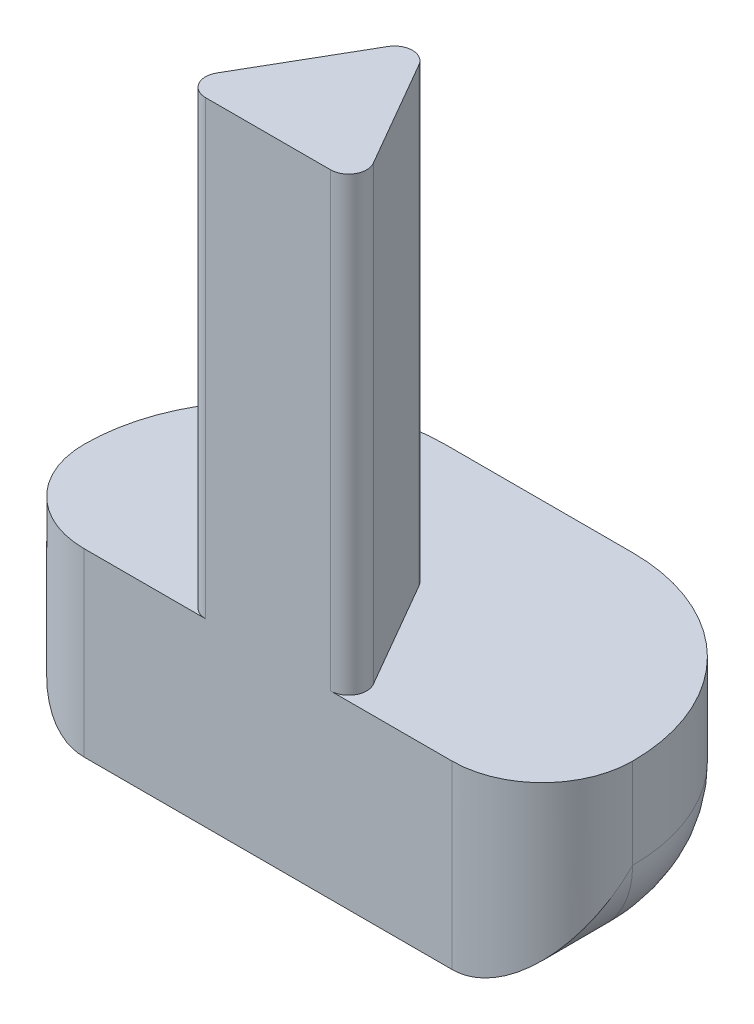
ISO-10303-21;
HEADER;
FILE_DESCRIPTION(('STEP AP214'),'2;1');
FILE_NAME('part.step','',(''),(''),'','','');
FILE_SCHEMA(('AUTOMOTIVE_DESIGN { 1 0 10303 214 1 1 1 1 }'));
ENDSEC;
DATA;
#1=APPLICATION_CONTEXT('core data for automotive mechanical design processes');
#2=APPLICATION_PROTOCOL_DEFINITION('international standard','automotive_design',2000,#1);
#3=PRODUCT_CONTEXT('',#1,'mechanical');
#4=PRODUCT('Part','Part','',(#3));
#5=PRODUCT_RELATED_PRODUCT_CATEGORY('part','',(#4));
#6=PRODUCT_DEFINITION_FORMATION('','',#4);
#7=PRODUCT_DEFINITION_CONTEXT('part definition',#1,'design');
#8=PRODUCT_DEFINITION('design','',#6,#7);
#9=PRODUCT_DEFINITION_SHAPE('','',#8);
#10=(LENGTH_UNIT() NAMED_UNIT(*) SI_UNIT(.MILLI.,.METRE.));
#11=(NAMED_UNIT(*) PLANE_ANGLE_UNIT() SI_UNIT($,.RADIAN.));
#12=(NAMED_UNIT(*) SI_UNIT($,.STERADIAN.) SOLID_ANGLE_UNIT());
#13=UNCERTAINTY_MEASURE_WITH_UNIT(LENGTH_MEASURE(1.E-05),#10,'distance_accuracy_value','');
#14=(GEOMETRIC_REPRESENTATION_CONTEXT(3) GLOBAL_UNCERTAINTY_ASSIGNED_CONTEXT((#13)) GLOBAL_UNIT_ASSIGNED_CONTEXT((#10,
#11,#12)) REPRESENTATION_CONTEXT('',''));
#15=CARTESIAN_POINT('',(0.,0.,0.));
#16=DIRECTION('',(0.,0.,1.));
#17=DIRECTION('',(1.,0.,0.));
#18=AXIS2_PLACEMENT_3D('',#15,#16,#17);
#19=CARTESIAN_POINT('',(-1.03923048454133,5.,-1.8));
#20=DIRECTION('',(-0.866025403784439,0.,0.5));
#21=DIRECTION('',(0.5,0.,0.866025403784439));
#22=AXIS2_PLACEMENT_3D('',#19,#20,#21);
#23=PLANE('',#22);
#24=DIRECTION('',(-0.5,0.,-0.866025403784438));
#25=VECTOR('',#24,1.);
#26=CARTESIAN_POINT('',(-1.03923048454133,5.,-1.8));
#27=LINE('',#26,#25);
#28=CARTESIAN_POINT('',(-0.173205080756888,5.,-0.300000000000001));
#29=VERTEX_POINT('',#28);
#30=CARTESIAN_POINT('',(-0.866025403784439,5.,-1.5));
#31=VERTEX_POINT('',#30);
#32=EDGE_CURVE('E177',#29,#31,#27,.T.);
#33=ORIENTED_EDGE('',*,*,#32,.F.);
#34=DIRECTION('',(0.,-1.,0.));
#35=VECTOR('',#34,1.);
#36=CARTESIAN_POINT('',(-0.173205080756888,5.,-0.3));
#37=LINE('',#36,#35);
#38=CARTESIAN_POINT('',(-0.173205080756888,0.,-0.300000000000001));
#39=VERTEX_POINT('',#38);
#40=EDGE_CURVE('E228',#29,#39,#37,.T.);
#41=ORIENTED_EDGE('',*,*,#40,.T.);
#42=DIRECTION('',(-0.5,0.,-0.866025403784438));
#43=VECTOR('',#42,1.);
#44=CARTESIAN_POINT('',(-1.03923048454133,0.,-1.8));
#45=LINE('',#44,#43);
#46=CARTESIAN_POINT('',(-0.866025403784439,0.,-1.5));
#47=VERTEX_POINT('',#46);
#48=EDGE_CURVE('E145',#39,#47,#45,.T.);
#49=ORIENTED_EDGE('',*,*,#48,.T.);
#50=DIRECTION('',(0.,-1.,0.));
#51=VECTOR('',#50,1.);
#52=CARTESIAN_POINT('',(-0.866025403784439,5.,-1.5));
#53=LINE('',#52,#51);
#54=EDGE_CURVE('E213',#47,#31,#53,.F.);
#55=ORIENTED_EDGE('',*,*,#54,.T.);
#56=EDGE_LOOP('',(#33,#41,#49,#55));
#57=FACE_BOUND('',#56,.T.);
#58=ADVANCED_FACE('F35',(#57),#23,.F.);
#59=CARTESIAN_POINT('',(-2.07846096908265,5.,0.));
#60=DIRECTION('',(0.866025403784439,0.,0.5));
#61=DIRECTION('',(0.5,0.,-0.866025403784439));
#62=AXIS2_PLACEMENT_3D('',#59,#60,#61);
#63=PLANE('',#62);
#64=DIRECTION('',(-0.5,0.,0.866025403784439));
#65=VECTOR('',#64,1.);
#66=CARTESIAN_POINT('',(-2.07846096908265,0.,0.));
#67=LINE('',#66,#65);
#68=CARTESIAN_POINT('',(-1.21243556529821,0.,-1.5));
#69=VERTEX_POINT('',#68);
#70=CARTESIAN_POINT('',(-1.90525588832576,0.,-0.3));
#71=VERTEX_POINT('',#70);
#72=EDGE_CURVE('E181',#69,#71,#67,.T.);
#73=ORIENTED_EDGE('',*,*,#72,.T.);
#74=DIRECTION('',(0.,-1.,0.));
#75=VECTOR('',#74,1.);
#76=CARTESIAN_POINT('',(-1.90525588832576,5.,-0.3));
#77=LINE('',#76,#75);
#78=CARTESIAN_POINT('',(-1.90525588832576,5.,-0.3));
#79=VERTEX_POINT('',#78);
#80=EDGE_CURVE('E244',#71,#79,#77,.F.);
#81=ORIENTED_EDGE('',*,*,#80,.T.);
#82=DIRECTION('',(-0.5,0.,0.866025403784439));
#83=VECTOR('',#82,1.);
#84=CARTESIAN_POINT('',(-2.07846096908265,5.,0.));
#85=LINE('',#84,#83);
#86=CARTESIAN_POINT('',(-1.21243556529821,5.,-1.5));
#87=VERTEX_POINT('',#86);
#88=EDGE_CURVE('E180',#87,#79,#85,.T.);
#89=ORIENTED_EDGE('',*,*,#88,.F.);
#90=DIRECTION('',(0.,-1.,0.));
#91=VECTOR('',#90,1.);
#92=CARTESIAN_POINT('',(-1.21243556529821,5.,-1.5));
#93=LINE('',#92,#91);
#94=EDGE_CURVE('E242',#87,#69,#93,.T.);
#95=ORIENTED_EDGE('',*,*,#94,.T.);
#96=EDGE_LOOP('',(#73,#81,#89,#95));
#97=FACE_BOUND('',#96,.T.);
#98=ADVANCED_FACE('F312',(#97),#63,.F.);
#99=CARTESIAN_POINT('',(0.,5.,0.));
#100=DIRECTION('',(0.,0.,-1.));
#101=DIRECTION('',(-1.,0.,0.));
#102=AXIS2_PLACEMENT_3D('',#99,#100,#101);
#103=PLANE('',#102);
#104=DIRECTION('',(1.,0.,0.));
#105=VECTOR('',#104,1.);
#106=CARTESIAN_POINT('',(-4.07846096908265,0.,0.));
#107=LINE('',#106,#105);
#108=CARTESIAN_POINT('',(-0.346410161513775,0.,0.));
#109=VERTEX_POINT('',#108);
#110=CARTESIAN_POINT('',(0.999999999999998,0.,0.));
#111=VERTEX_POINT('',#110);
#112=EDGE_CURVE('E156',#109,#111,#107,.T.);
#113=ORIENTED_EDGE('',*,*,#112,.F.);
#114=DIRECTION('',(0.,-1.,0.));
#115=VECTOR('',#114,1.);
#116=CARTESIAN_POINT('',(-0.346410161513775,5.,0.));
#117=LINE('',#116,#115);
#118=CARTESIAN_POINT('',(-0.346410161513775,5.,0.));
#119=VERTEX_POINT('',#118);
#120=EDGE_CURVE('E234',#109,#119,#117,.F.);
#121=ORIENTED_EDGE('',*,*,#120,.T.);
#122=DIRECTION('',(1.,0.,0.));
#123=VECTOR('',#122,1.);
#124=CARTESIAN_POINT('',(0.,5.,0.));
#125=LINE('',#124,#123);
#126=CARTESIAN_POINT('',(-1.73205080756888,5.,0.));
#127=VERTEX_POINT('',#126);
#128=EDGE_CURVE('E184',#127,#119,#125,.T.);
#129=ORIENTED_EDGE('',*,*,#128,.F.);
#130=DIRECTION('',(0.,-1.,0.));
#131=VECTOR('',#130,1.);
#132=CARTESIAN_POINT('',(-1.73205080756888,5.,0.));
#133=LINE('',#132,#131);
#134=CARTESIAN_POINT('',(-1.73205080756888,0.,0.));
#135=VERTEX_POINT('',#134);
#136=EDGE_CURVE('E231',#127,#135,#133,.T.);
#137=ORIENTED_EDGE('',*,*,#136,.T.);
#138=CARTESIAN_POINT('',(-3.07846096908265,0.,0.));
#139=VERTEX_POINT('',#138);
#140=EDGE_CURVE('E169',#139,#135,#107,.T.);
#141=ORIENTED_EDGE('',*,*,#140,.F.);
#142=DIRECTION('',(0.,1.,0.));
#143=VECTOR('',#142,1.);
#144=CARTESIAN_POINT('',(-3.07846096908265,5.,0.));
#145=LINE('',#144,#143);
#146=CARTESIAN_POINT('',(-3.07846096908265,-2.,0.));
#147=VERTEX_POINT('',#146);
#148=EDGE_CURVE('E211',#139,#147,#145,.F.);
#149=ORIENTED_EDGE('',*,*,#148,.T.);
#150=DIRECTION('',(1.,0.,0.));
#151=VECTOR('',#150,1.);
#152=CARTESIAN_POINT('',(-4.07846096908265,-2.,0.));
#153=LINE('',#152,#151);
#154=CARTESIAN_POINT('',(0.999999999999998,-2.,0.));
#155=VERTEX_POINT('',#154);
#156=EDGE_CURVE('E167',#147,#155,#153,.T.);
#157=ORIENTED_EDGE('',*,*,#156,.T.);
#158=DIRECTION('',(0.,1.,0.));
#159=VECTOR('',#158,1.);
#160=CARTESIAN_POINT('',(1.,0.,0.));
#161=LINE('',#160,#159);
#162=EDGE_CURVE('E209',#155,#111,#161,.T.);
#163=ORIENTED_EDGE('',*,*,#162,.T.);
#164=EDGE_LOOP('',(#113,#121,#129,#137,#141,#149,#157,#163));
#165=FACE_BOUND('',#164,.T.);
#166=ADVANCED_FACE('F256',(#165),#103,.F.);
#167=CARTESIAN_POINT('',(0.,5.,0.));
#168=DIRECTION('',(0.,-1.,0.));
#169=DIRECTION('',(0.,0.,-1.));
#170=AXIS2_PLACEMENT_3D('',#167,#168,#169);
#171=PLANE('',#170);
#172=ORIENTED_EDGE('',*,*,#128,.T.);
#173=CARTESIAN_POINT('',(-0.346410161513775,5.,-0.2));
#174=DIRECTION('',(0.,-1.,0.));
#175=DIRECTION('',(0.,0.,-1.));
#176=AXIS2_PLACEMENT_3D('',#173,#174,#175);
#177=CIRCLE('',#176,0.2);
#178=EDGE_CURVE('E240',#119,#29,#177,.F.);
#179=ORIENTED_EDGE('',*,*,#178,.T.);
#180=ORIENTED_EDGE('',*,*,#32,.T.);
#181=CARTESIAN_POINT('',(-1.03923048454133,5.,-1.4));
#182=DIRECTION('',(0.,-1.,0.));
#183=DIRECTION('',(0.,0.,-1.));
#184=AXIS2_PLACEMENT_3D('',#181,#182,#183);
#185=CIRCLE('',#184,0.2);
#186=EDGE_CURVE('E236',#31,#87,#185,.F.);
#187=ORIENTED_EDGE('',*,*,#186,.T.);
#188=ORIENTED_EDGE('',*,*,#88,.T.);
#189=CARTESIAN_POINT('',(-1.73205080756888,5.,-0.2));
#190=DIRECTION('',(0.,-1.,0.));
#191=DIRECTION('',(0.,0.,-1.));
#192=AXIS2_PLACEMENT_3D('',#189,#190,#191);
#193=CIRCLE('',#192,0.2);
#194=EDGE_CURVE('E238',#79,#127,#193,.F.);
#195=ORIENTED_EDGE('',*,*,#194,.T.);
#196=EDGE_LOOP('',(#172,#179,#180,#187,#188,#195));
#197=FACE_BOUND('',#196,.T.);
#198=ADVANCED_FACE('F259',(#197),#171,.F.);
#199=CARTESIAN_POINT('',(-2.07846096908264,-2.,-3.));
#200=DIRECTION('',(0.,0.,1.));
#201=DIRECTION('',(1.,0.,0.));
#202=AXIS2_PLACEMENT_3D('',#199,#200,#201);
#203=PLANE('',#202);
#204=DIRECTION('',(0.,1.,0.));
#205=VECTOR('',#204,1.);
#206=CARTESIAN_POINT('',(0.,-2.,-3.));
#207=LINE('',#206,#205);
#208=CARTESIAN_POINT('',(0.,-1.,-3.));
#209=VERTEX_POINT('',#208);
#210=CARTESIAN_POINT('',(0.,0.,-3.));
#211=VERTEX_POINT('',#210);
#212=EDGE_CURVE('E135',#209,#211,#207,.T.);
#213=ORIENTED_EDGE('',*,*,#212,.F.);
#214=DIRECTION('',(1.,0.,0.));
#215=VECTOR('',#214,1.);
#216=CARTESIAN_POINT('',(-2.07846096908264,-1.,-3.));
#217=LINE('',#216,#215);
#218=CARTESIAN_POINT('',(-2.07846096908264,-1.,-3.));
#219=VERTEX_POINT('',#218);
#220=EDGE_CURVE('E203',#209,#219,#217,.F.);
#221=ORIENTED_EDGE('',*,*,#220,.T.);
#222=DIRECTION('',(0.,1.,0.));
#223=VECTOR('',#222,1.);
#224=CARTESIAN_POINT('',(-2.07846096908264,-2.,-3.));
#225=LINE('',#224,#223);
#226=CARTESIAN_POINT('',(-2.07846096908264,0.,-3.));
#227=VERTEX_POINT('',#226);
#228=EDGE_CURVE('E160',#219,#227,#225,.T.);
#229=ORIENTED_EDGE('',*,*,#228,.T.);
#230=DIRECTION('',(1.,0.,0.));
#231=VECTOR('',#230,1.);
#232=CARTESIAN_POINT('',(-2.07846096908264,0.,-3.));
#233=LINE('',#232,#231);
#234=EDGE_CURVE('E151',#227,#211,#233,.T.);
#235=ORIENTED_EDGE('',*,*,#234,.T.);
#236=EDGE_LOOP('',(#213,#221,#229,#235));
#237=FACE_BOUND('',#236,.T.);
#238=ADVANCED_FACE('F158',(#237),#203,.F.);
#239=CARTESIAN_POINT('',(0.,-2.,-1.));
#240=DIRECTION('',(0.,1.,0.));
#241=DIRECTION('',(0.,0.,1.));
#242=AXIS2_PLACEMENT_3D('',#239,#240,#241);
#243=CYLINDRICAL_SURFACE('',#242,2.);
#244=DIRECTION('',(0.,1.,0.));
#245=VECTOR('',#244,1.);
#246=CARTESIAN_POINT('',(2.,-2.,-0.999999999999986));
#247=LINE('',#246,#245);
#248=CARTESIAN_POINT('',(2.,-1.,-0.999999999999986));
#249=VERTEX_POINT('',#248);
#250=CARTESIAN_POINT('',(2.,0.,-0.999999999999986));
#251=VERTEX_POINT('',#250);
#252=EDGE_CURVE('E146',#249,#251,#247,.T.);
#253=ORIENTED_EDGE('',*,*,#252,.F.);
#254=CARTESIAN_POINT('',(0.,-1.,-1.));
#255=DIRECTION('',(0.,-1.,0.));
#256=DIRECTION('',(0.,0.,-1.));
#257=AXIS2_PLACEMENT_3D('',#254,#255,#256);
#258=CIRCLE('',#257,2.);
#259=EDGE_CURVE('E141',#249,#209,#258,.F.);
#260=ORIENTED_EDGE('',*,*,#259,.T.);
#261=ORIENTED_EDGE('',*,*,#212,.T.);
#262=CARTESIAN_POINT('',(0.,0.,-1.));
#263=DIRECTION('',(0.,-1.,0.));
#264=DIRECTION('',(0.,0.,-1.));
#265=AXIS2_PLACEMENT_3D('',#262,#263,#264);
#266=CIRCLE('',#265,2.);
#267=EDGE_CURVE('E138',#211,#251,#266,.T.);
#268=ORIENTED_EDGE('',*,*,#267,.T.);
#269=EDGE_LOOP('',(#253,#260,#261,#268));
#270=FACE_BOUND('',#269,.T.);
#271=ADVANCED_FACE('F137',(#270),#243,.T.);
#272=CARTESIAN_POINT('',(-2.07846096908265,-2.,-1.));
#273=DIRECTION('',(0.,1.,0.));
#274=DIRECTION('',(0.,0.,1.));
#275=AXIS2_PLACEMENT_3D('',#272,#273,#274);
#276=CYLINDRICAL_SURFACE('',#275,2.);
#277=ORIENTED_EDGE('',*,*,#228,.F.);
#278=CARTESIAN_POINT('',(-2.07846096908265,-1.,-1.));
#279=DIRECTION('',(0.,-1.,0.));
#280=DIRECTION('',(0.,0.,-1.));
#281=AXIS2_PLACEMENT_3D('',#278,#279,#280);
#282=CIRCLE('',#281,2.);
#283=CARTESIAN_POINT('',(-4.07846096908265,-1.,-0.999999999999986));
#284=VERTEX_POINT('',#283);
#285=EDGE_CURVE('E201',#219,#284,#282,.F.);
#286=ORIENTED_EDGE('',*,*,#285,.T.);
#287=DIRECTION('',(0.,1.,0.));
#288=VECTOR('',#287,1.);
#289=CARTESIAN_POINT('',(-4.07846096908265,-2.,-0.999999999999986));
#290=LINE('',#289,#288);
#291=CARTESIAN_POINT('',(-4.07846096908265,0.,-0.999999999999986));
#292=VERTEX_POINT('',#291);
#293=EDGE_CURVE('E174',#284,#292,#290,.T.);
#294=ORIENTED_EDGE('',*,*,#293,.T.);
#295=CARTESIAN_POINT('',(-2.07846096908265,0.,-1.));
#296=DIRECTION('',(0.,1.,0.));
#297=DIRECTION('',(0.,0.,1.));
#298=AXIS2_PLACEMENT_3D('',#295,#296,#297);
#299=CIRCLE('',#298,2.);
#300=EDGE_CURVE('E171',#227,#292,#299,.T.);
#301=ORIENTED_EDGE('',*,*,#300,.F.);
#302=EDGE_LOOP('',(#277,#286,#294,#301));
#303=FACE_BOUND('',#302,.T.);
#304=ADVANCED_FACE('F300',(#303),#276,.T.);
#305=CARTESIAN_POINT('',(0.,-2.,-1.));
#306=DIRECTION('',(0.,-1.,0.));
#307=DIRECTION('',(0.,0.,-1.));
#308=AXIS2_PLACEMENT_3D('',#305,#306,#307);
#309=PLANE('',#308);
#310=ORIENTED_EDGE('',*,*,#156,.F.);
#311=DIRECTION('',(0.,0.,-1.));
#312=VECTOR('',#311,1.);
#313=CARTESIAN_POINT('',(-3.07846096908265,-2.,-0.999999999999986));
#314=LINE('',#313,#312);
#315=CARTESIAN_POINT('',(-3.07846096908265,-2.,-0.999999999999986));
#316=VERTEX_POINT('',#315);
#317=EDGE_CURVE('E198',#147,#316,#314,.T.);
#318=ORIENTED_EDGE('',*,*,#317,.T.);
#319=CARTESIAN_POINT('',(-2.07846096908265,-2.,-1.));
#320=DIRECTION('',(0.,-1.,0.));
#321=DIRECTION('',(0.,0.,-1.));
#322=AXIS2_PLACEMENT_3D('',#319,#320,#321);
#323=CIRCLE('',#322,1.);
#324=CARTESIAN_POINT('',(-2.07846096908265,-2.,-2.));
#325=VERTEX_POINT('',#324);
#326=EDGE_CURVE('E196',#316,#325,#323,.T.);
#327=ORIENTED_EDGE('',*,*,#326,.T.);
#328=DIRECTION('',(1.,0.,0.));
#329=VECTOR('',#328,1.);
#330=CARTESIAN_POINT('',(0.,-2.,-2.));
#331=LINE('',#330,#329);
#332=CARTESIAN_POINT('',(0.,-2.,-2.));
#333=VERTEX_POINT('',#332);
#334=EDGE_CURVE('E194',#325,#333,#331,.T.);
#335=ORIENTED_EDGE('',*,*,#334,.T.);
#336=CARTESIAN_POINT('',(0.,-2.,-1.));
#337=DIRECTION('',(0.,-1.,0.));
#338=DIRECTION('',(0.,0.,-1.));
#339=AXIS2_PLACEMENT_3D('',#336,#337,#338);
#340=CIRCLE('',#339,1.);
#341=CARTESIAN_POINT('',(1.,-2.,-0.999999999999986));
#342=VERTEX_POINT('',#341);
#343=EDGE_CURVE('E187',#333,#342,#340,.T.);
#344=ORIENTED_EDGE('',*,*,#343,.T.);
#345=DIRECTION('',(0.,0.,-1.));
#346=VECTOR('',#345,1.);
#347=CARTESIAN_POINT('',(1.,-2.,-1.));
#348=LINE('',#347,#346);
#349=EDGE_CURVE('E192',#342,#155,#348,.F.);
#350=ORIENTED_EDGE('',*,*,#349,.T.);
#351=EDGE_LOOP('',(#310,#318,#327,#335,#344,#350));
#352=FACE_BOUND('',#351,.T.);
#353=ADVANCED_FACE('F281',(#352),#309,.T.);
#354=CARTESIAN_POINT('',(0.,0.,-1.));
#355=DIRECTION('',(0.,-1.,0.));
#356=DIRECTION('',(0.,0.,-1.));
#357=AXIS2_PLACEMENT_3D('',#354,#355,#356);
#358=PLANE('',#357);
#359=ORIENTED_EDGE('',*,*,#300,.T.);
#360=CARTESIAN_POINT('',(-3.07846096908265,0.,-1.));
#361=DIRECTION('',(0.,-1.,0.));
#362=DIRECTION('',(0.,0.,-1.));
#363=AXIS2_PLACEMENT_3D('',#360,#361,#362);
#364=CIRCLE('',#363,1.);
#365=EDGE_CURVE('E207',#292,#139,#364,.F.);
#366=ORIENTED_EDGE('',*,*,#365,.T.);
#367=ORIENTED_EDGE('',*,*,#140,.T.);
#368=CARTESIAN_POINT('',(-1.73205080756888,0.,-0.2));
#369=DIRECTION('',(0.,-1.,0.));
#370=DIRECTION('',(0.,0.,-1.));
#371=AXIS2_PLACEMENT_3D('',#368,#369,#370);
#372=CIRCLE('',#371,0.2);
#373=EDGE_CURVE('E43',#135,#71,#372,.T.);
#374=ORIENTED_EDGE('',*,*,#373,.T.);
#375=ORIENTED_EDGE('',*,*,#72,.F.);
#376=CARTESIAN_POINT('',(-1.03923048454133,0.,-1.4));
#377=DIRECTION('',(0.,-1.,0.));
#378=DIRECTION('',(0.,0.,-1.));
#379=AXIS2_PLACEMENT_3D('',#376,#377,#378);
#380=CIRCLE('',#379,0.2);
#381=EDGE_CURVE('E11',#69,#47,#380,.T.);
#382=ORIENTED_EDGE('',*,*,#381,.T.);
#383=ORIENTED_EDGE('',*,*,#48,.F.);
#384=CARTESIAN_POINT('',(-0.346410161513775,0.,-0.2));
#385=DIRECTION('',(0.,-1.,0.));
#386=DIRECTION('',(0.,0.,-1.));
#387=AXIS2_PLACEMENT_3D('',#384,#385,#386);
#388=CIRCLE('',#387,0.2);
#389=EDGE_CURVE('E246',#39,#109,#388,.T.);
#390=ORIENTED_EDGE('',*,*,#389,.T.);
#391=ORIENTED_EDGE('',*,*,#112,.T.);
#392=CARTESIAN_POINT('',(1.,0.,-1.));
#393=DIRECTION('',(0.,-1.,0.));
#394=DIRECTION('',(0.,0.,-1.));
#395=AXIS2_PLACEMENT_3D('',#392,#393,#394);
#396=CIRCLE('',#395,1.);
#397=EDGE_CURVE('E155',#111,#251,#396,.F.);
#398=ORIENTED_EDGE('',*,*,#397,.T.);
#399=ORIENTED_EDGE('',*,*,#267,.F.);
#400=ORIENTED_EDGE('',*,*,#234,.F.);
#401=EDGE_LOOP('',(#359,#366,#367,#374,#375,#382,#383,#390,#391,#398,#399,#400));
#402=FACE_BOUND('',#401,.T.);
#403=ADVANCED_FACE('F150',(#402),#358,.F.);
#404=CARTESIAN_POINT('',(1.,5.,-1.));
#405=DIRECTION('',(0.,-1.,0.));
#406=DIRECTION('',(0.,0.,-1.));
#407=AXIS2_PLACEMENT_3D('',#404,#405,#406);
#408=CYLINDRICAL_SURFACE('',#407,1.);
#409=ORIENTED_EDGE('',*,*,#397,.F.);
#410=ORIENTED_EDGE('',*,*,#162,.F.);
#411=CARTESIAN_POINT('',(1.,-1.,-1.));
#412=DIRECTION('',(0.,-0.707106781186547,-0.707106781186547));
#413=DIRECTION('',(0.,-0.707106781186547,0.707106781186547));
#414=AXIS2_PLACEMENT_3D('',#411,#412,#413);
#415=ELLIPSE('',#414,1.41421356237309,1.);
#416=EDGE_CURVE('E161',#249,#155,#415,.T.);
#417=ORIENTED_EDGE('',*,*,#416,.F.);
#418=ORIENTED_EDGE('',*,*,#252,.T.);
#419=EDGE_LOOP('',(#409,#410,#417,#418));
#420=FACE_BOUND('',#419,.T.);
#421=ADVANCED_FACE('F287',(#420),#408,.T.);
#422=CARTESIAN_POINT('',(1.,-1.,0.));
#423=DIRECTION('',(0.,0.,-1.));
#424=DIRECTION('',(-1.,0.,0.));
#425=AXIS2_PLACEMENT_3D('',#422,#423,#424);
#426=CYLINDRICAL_SURFACE('',#425,1.);
#427=ORIENTED_EDGE('',*,*,#416,.T.);
#428=ORIENTED_EDGE('',*,*,#349,.F.);
#429=CARTESIAN_POINT('',(1.,-1.,-0.999999999999986));
#430=DIRECTION('',(0.,0.,-1.));
#431=DIRECTION('',(-1.,0.,0.));
#432=AXIS2_PLACEMENT_3D('',#429,#430,#431);
#433=CIRCLE('',#432,1.);
#434=EDGE_CURVE('E164',#249,#342,#433,.T.);
#435=ORIENTED_EDGE('',*,*,#434,.F.);
#436=EDGE_LOOP('',(#427,#428,#435));
#437=FACE_BOUND('',#436,.T.);
#438=ADVANCED_FACE('F290',(#437),#426,.T.);
#439=CARTESIAN_POINT('',(0.,-1.,-1.));
#440=DIRECTION('',(0.,-1.,0.));
#441=DIRECTION('',(0.,0.,-1.));
#442=AXIS2_PLACEMENT_3D('',#439,#440,#441);
#443=DEGENERATE_TOROIDAL_SURFACE('',#442,1.,1.,.T.);
#444=ORIENTED_EDGE('',*,*,#434,.T.);
#445=ORIENTED_EDGE('',*,*,#343,.F.);
#446=CARTESIAN_POINT('',(0.,-1.,-2.));
#447=DIRECTION('',(-1.,0.,0.));
#448=DIRECTION('',(0.,0.,1.));
#449=AXIS2_PLACEMENT_3D('',#446,#447,#448);
#450=CIRCLE('',#449,1.);
#451=EDGE_CURVE('E222',#209,#333,#450,.T.);
#452=ORIENTED_EDGE('',*,*,#451,.F.);
#453=ORIENTED_EDGE('',*,*,#259,.F.);
#454=EDGE_LOOP('',(#444,#445,#452,#453));
#455=FACE_BOUND('',#454,.T.);
#456=ADVANCED_FACE('F293',(#455),#443,.T.);
#457=CARTESIAN_POINT('',(0.,-1.,-2.));
#458=DIRECTION('',(-1.,0.,0.));
#459=DIRECTION('',(0.,0.,1.));
#460=AXIS2_PLACEMENT_3D('',#457,#458,#459);
#461=CYLINDRICAL_SURFACE('',#460,1.);
#462=ORIENTED_EDGE('',*,*,#451,.T.);
#463=ORIENTED_EDGE('',*,*,#334,.F.);
#464=CARTESIAN_POINT('',(-2.07846096908264,-1.,-2.));
#465=DIRECTION('',(-1.,0.,0.));
#466=DIRECTION('',(0.,-1.,0.));
#467=AXIS2_PLACEMENT_3D('',#464,#465,#466);
#468=CIRCLE('',#467,1.);
#469=EDGE_CURVE('E219',#219,#325,#468,.T.);
#470=ORIENTED_EDGE('',*,*,#469,.F.);
#471=ORIENTED_EDGE('',*,*,#220,.F.);
#472=EDGE_LOOP('',(#462,#463,#470,#471));
#473=FACE_BOUND('',#472,.T.);
#474=ADVANCED_FACE('F297',(#473),#461,.T.);
#475=CARTESIAN_POINT('',(-3.07846096908265,-2.,-1.));
#476=DIRECTION('',(0.,1.,0.));
#477=DIRECTION('',(0.,0.,1.));
#478=AXIS2_PLACEMENT_3D('',#475,#476,#477);
#479=CYLINDRICAL_SURFACE('',#478,1.);
#480=ORIENTED_EDGE('',*,*,#365,.F.);
#481=ORIENTED_EDGE('',*,*,#293,.F.);
#482=CARTESIAN_POINT('',(-3.07846096908265,-1.,-1.));
#483=DIRECTION('',(0.,0.707106781186547,0.707106781186547));
#484=DIRECTION('',(0.,0.707106781186547,-0.707106781186547));
#485=AXIS2_PLACEMENT_3D('',#482,#483,#484);
#486=ELLIPSE('',#485,1.41421356237309,1.);
#487=EDGE_CURVE('E216',#147,#284,#486,.F.);
#488=ORIENTED_EDGE('',*,*,#487,.F.);
#489=ORIENTED_EDGE('',*,*,#148,.F.);
#490=EDGE_LOOP('',(#480,#481,#488,#489));
#491=FACE_BOUND('',#490,.T.);
#492=ADVANCED_FACE('F273',(#491),#479,.T.);
#493=CARTESIAN_POINT('',(-2.07846096908265,-1.,-1.));
#494=DIRECTION('',(0.,-1.,0.));
#495=DIRECTION('',(0.,0.,-1.));
#496=AXIS2_PLACEMENT_3D('',#493,#494,#495);
#497=DEGENERATE_TOROIDAL_SURFACE('',#496,1.,1.,.T.);
#498=ORIENTED_EDGE('',*,*,#469,.T.);
#499=ORIENTED_EDGE('',*,*,#326,.F.);
#500=CARTESIAN_POINT('',(-3.07846096908265,-1.,-0.999999999999993));
#501=DIRECTION('',(0.,0.,1.));
#502=DIRECTION('',(1.,0.,0.));
#503=AXIS2_PLACEMENT_3D('',#500,#501,#502);
#504=CIRCLE('',#503,1.);
#505=EDGE_CURVE('E214',#284,#316,#504,.T.);
#506=ORIENTED_EDGE('',*,*,#505,.F.);
#507=ORIENTED_EDGE('',*,*,#285,.F.);
#508=EDGE_LOOP('',(#498,#499,#506,#507));
#509=FACE_BOUND('',#508,.T.);
#510=ADVANCED_FACE('F302',(#509),#497,.T.);
#511=CARTESIAN_POINT('',(-3.07846096908265,-1.,-1.));
#512=DIRECTION('',(0.,0.,1.));
#513=DIRECTION('',(1.,0.,0.));
#514=AXIS2_PLACEMENT_3D('',#511,#512,#513);
#515=CYLINDRICAL_SURFACE('',#514,1.);
#516=ORIENTED_EDGE('',*,*,#317,.F.);
#517=ORIENTED_EDGE('',*,*,#487,.T.);
#518=ORIENTED_EDGE('',*,*,#505,.T.);
#519=EDGE_LOOP('',(#516,#517,#518));
#520=FACE_BOUND('',#519,.T.);
#521=ADVANCED_FACE('F278',(#520),#515,.T.);
#522=CARTESIAN_POINT('',(-0.346410161513775,5.,-0.2));
#523=DIRECTION('',(0.,-1.,0.));
#524=DIRECTION('',(0.,0.,-1.));
#525=AXIS2_PLACEMENT_3D('',#522,#523,#524);
#526=CYLINDRICAL_SURFACE('',#525,0.2);
#527=ORIENTED_EDGE('',*,*,#178,.F.);
#528=ORIENTED_EDGE('',*,*,#120,.F.);
#529=ORIENTED_EDGE('',*,*,#389,.F.);
#530=ORIENTED_EDGE('',*,*,#40,.F.);
#531=EDGE_LOOP('',(#527,#528,#529,#530));
#532=FACE_BOUND('',#531,.T.);
#533=ADVANCED_FACE('F253',(#532),#526,.T.);
#534=CARTESIAN_POINT('',(-1.73205080756888,5.,-0.2));
#535=DIRECTION('',(0.,-1.,0.));
#536=DIRECTION('',(0.,0.,-1.));
#537=AXIS2_PLACEMENT_3D('',#534,#535,#536);
#538=CYLINDRICAL_SURFACE('',#537,0.2);
#539=ORIENTED_EDGE('',*,*,#194,.F.);
#540=ORIENTED_EDGE('',*,*,#80,.F.);
#541=ORIENTED_EDGE('',*,*,#373,.F.);
#542=ORIENTED_EDGE('',*,*,#136,.F.);
#543=EDGE_LOOP('',(#539,#540,#541,#542));
#544=FACE_BOUND('',#543,.T.);
#545=ADVANCED_FACE('F265',(#544),#538,.T.);
#546=CARTESIAN_POINT('',(-1.03923048454133,5.,-1.4));
#547=DIRECTION('',(0.,-1.,0.));
#548=DIRECTION('',(0.,0.,-1.));
#549=AXIS2_PLACEMENT_3D('',#546,#547,#548);
#550=CYLINDRICAL_SURFACE('',#549,0.2);
#551=ORIENTED_EDGE('',*,*,#186,.F.);
#552=ORIENTED_EDGE('',*,*,#54,.F.);
#553=ORIENTED_EDGE('',*,*,#381,.F.);
#554=ORIENTED_EDGE('',*,*,#94,.F.);
#555=EDGE_LOOP('',(#551,#552,#553,#554));
#556=FACE_BOUND('',#555,.T.);
#557=ADVANCED_FACE('F37',(#556),#550,.T.);
#558=CLOSED_SHELL('',(#58,#98,#166,#198,#238,#271,#304,#353,#403,#421,#438,#456,#474,#492,#510,
#521,#533,#545,#557));
#559=MANIFOLD_SOLID_BREP('B2',#558);
#560=ADVANCED_BREP_SHAPE_REPRESENTATION('',(#18,#559),#14);
#561=SHAPE_DEFINITION_REPRESENTATION(#9,#560);
ENDSEC;
END-ISO-10303-21;
